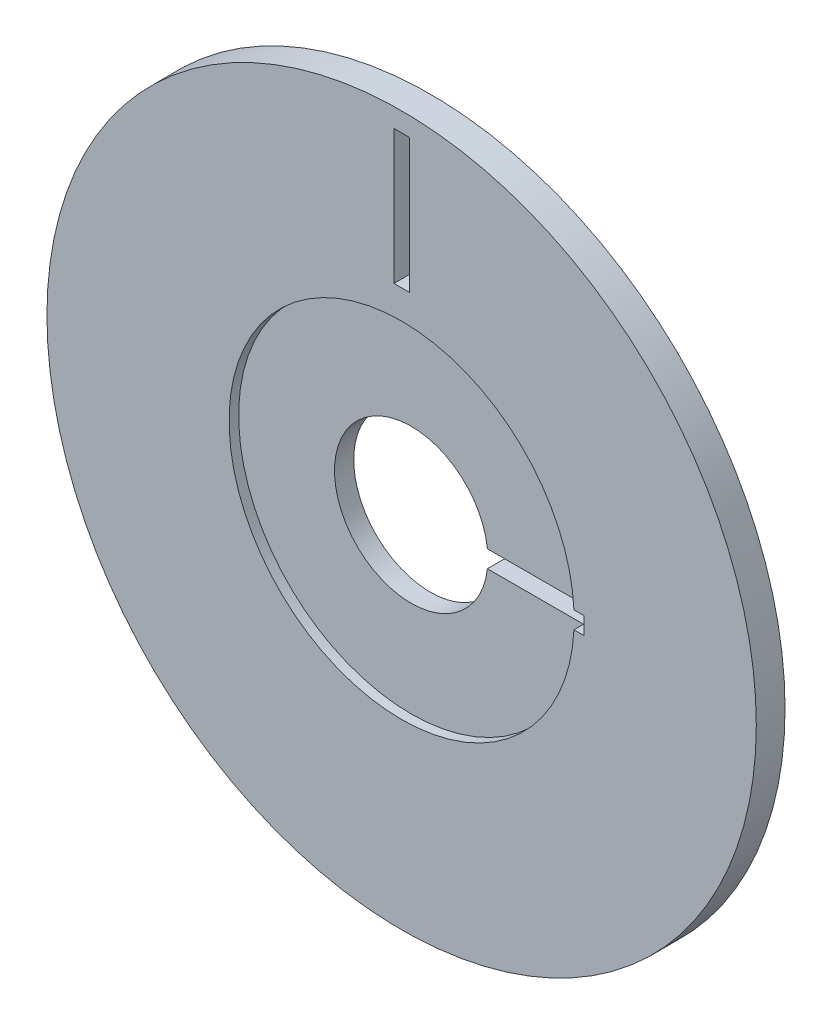
ISO-10303-21;
HEADER;
FILE_DESCRIPTION(('STEP AP214'),'2;1');
FILE_NAME('part.step','',(''),(''),'','','');
FILE_SCHEMA(('AUTOMOTIVE_DESIGN { 1 0 10303 214 1 1 1 1 }'));
ENDSEC;
DATA;
#1=APPLICATION_CONTEXT('core data for automotive mechanical design processes');
#2=APPLICATION_PROTOCOL_DEFINITION('international standard','automotive_design',2000,#1);
#3=PRODUCT_CONTEXT('',#1,'mechanical');
#4=PRODUCT('Part','Part','',(#3));
#5=PRODUCT_RELATED_PRODUCT_CATEGORY('part','',(#4));
#6=PRODUCT_DEFINITION_FORMATION('','',#4);
#7=PRODUCT_DEFINITION_CONTEXT('part definition',#1,'design');
#8=PRODUCT_DEFINITION('design','',#6,#7);
#9=PRODUCT_DEFINITION_SHAPE('','',#8);
#10=(LENGTH_UNIT() NAMED_UNIT(*) SI_UNIT(.MILLI.,.METRE.));
#11=(NAMED_UNIT(*) PLANE_ANGLE_UNIT() SI_UNIT($,.RADIAN.));
#12=(NAMED_UNIT(*) SI_UNIT($,.STERADIAN.) SOLID_ANGLE_UNIT());
#13=UNCERTAINTY_MEASURE_WITH_UNIT(LENGTH_MEASURE(1.E-05),#10,'distance_accuracy_value','');
#14=(GEOMETRIC_REPRESENTATION_CONTEXT(3) GLOBAL_UNCERTAINTY_ASSIGNED_CONTEXT((#13)) GLOBAL_UNIT_ASSIGNED_CONTEXT((#10,
#11,#12)) REPRESENTATION_CONTEXT('',''));
#15=CARTESIAN_POINT('',(0.,0.,0.));
#16=DIRECTION('',(0.,0.,1.));
#17=DIRECTION('',(1.,0.,0.));
#18=AXIS2_PLACEMENT_3D('',#15,#16,#17);
#19=CARTESIAN_POINT('',(0.,0.,0.));
#20=DIRECTION('',(0.,0.,1.));
#21=DIRECTION('',(1.,0.,0.));
#22=AXIS2_PLACEMENT_3D('',#19,#20,#21);
#23=CYLINDRICAL_SURFACE('',#22,4.);
#24=CARTESIAN_POINT('',(0.,0.,0.));
#25=DIRECTION('',(0.,0.,1.));
#26=DIRECTION('',(1.,0.,0.));
#27=AXIS2_PLACEMENT_3D('',#24,#25,#26);
#28=CIRCLE('',#27,4.);
#29=CARTESIAN_POINT('',(3.97460689880144,0.45,0.));
#30=VERTEX_POINT('',#29);
#31=CARTESIAN_POINT('',(3.97460689880144,-0.45,0.));
#32=VERTEX_POINT('',#31);
#33=EDGE_CURVE('E186',#30,#32,#28,.T.);
#34=ORIENTED_EDGE('',*,*,#33,.F.);
#35=DIRECTION('',(0.,0.,1.));
#36=VECTOR('',#35,1.);
#37=CARTESIAN_POINT('',(3.97460689880144,0.45,0.));
#38=LINE('',#37,#36);
#39=CARTESIAN_POINT('',(3.97460689880144,0.45,1.));
#40=VERTEX_POINT('',#39);
#41=EDGE_CURVE('E176',#30,#40,#38,.T.);
#42=ORIENTED_EDGE('',*,*,#41,.T.);
#43=CARTESIAN_POINT('',(0.,0.,1.));
#44=DIRECTION('',(0.,0.,1.));
#45=DIRECTION('',(1.,0.,0.));
#46=AXIS2_PLACEMENT_3D('',#43,#44,#45);
#47=CIRCLE('',#46,4.);
#48=CARTESIAN_POINT('',(3.97460689880144,-0.45,1.));
#49=VERTEX_POINT('',#48);
#50=EDGE_CURVE('E183',#49,#40,#47,.F.);
#51=ORIENTED_EDGE('',*,*,#50,.F.);
#52=DIRECTION('',(0.,0.,1.));
#53=VECTOR('',#52,1.);
#54=CARTESIAN_POINT('',(3.97460689880144,-0.45,0.));
#55=LINE('',#54,#53);
#56=EDGE_CURVE('E171',#49,#32,#55,.F.);
#57=ORIENTED_EDGE('',*,*,#56,.T.);
#58=EDGE_LOOP('',(#34,#42,#51,#57));
#59=FACE_BOUND('',#58,.T.);
#60=ADVANCED_FACE('F35',(#59),#23,.F.);
#61=CARTESIAN_POINT('',(0.,0.,1.5));
#62=DIRECTION('',(0.,0.,-1.));
#63=DIRECTION('',(-1.,0.,0.));
#64=AXIS2_PLACEMENT_3D('',#61,#62,#63);
#65=CYLINDRICAL_SURFACE('',#64,18.5);
#66=CARTESIAN_POINT('',(0.,0.,1.5));
#67=DIRECTION('',(0.,0.,1.));
#68=DIRECTION('',(1.,0.,0.));
#69=AXIS2_PLACEMENT_3D('',#66,#67,#68);
#70=CIRCLE('',#69,18.5);
#71=CARTESIAN_POINT('',(18.5,0.,1.5));
#72=VERTEX_POINT('',#71);
#73=EDGE_CURVE('E190',#72,#72,#70,.T.);
#74=ORIENTED_EDGE('',*,*,#73,.F.);
#75=EDGE_LOOP('',(#74));
#76=FACE_BOUND('',#75,.T.);
#77=CARTESIAN_POINT('',(0.,0.,0.));
#78=DIRECTION('',(0.,0.,1.));
#79=DIRECTION('',(1.,0.,0.));
#80=AXIS2_PLACEMENT_3D('',#77,#78,#79);
#81=CIRCLE('',#80,18.5);
#82=CARTESIAN_POINT('',(18.5,0.,0.));
#83=VERTEX_POINT('',#82);
#84=EDGE_CURVE('E189',#83,#83,#81,.T.);
#85=ORIENTED_EDGE('',*,*,#84,.T.);
#86=EDGE_LOOP('',(#85));
#87=FACE_BOUND('',#86,.T.);
#88=ADVANCED_FACE('F37',(#76,#87),#65,.T.);
#89=CARTESIAN_POINT('',(0.,0.,1.5));
#90=DIRECTION('',(0.,0.,1.));
#91=DIRECTION('',(1.,0.,0.));
#92=AXIS2_PLACEMENT_3D('',#89,#90,#91);
#93=PLANE('',#92);
#94=DIRECTION('',(0.,-1.,0.));
#95=VECTOR('',#94,1.);
#96=CARTESIAN_POINT('',(-0.399999999999996,17.5,1.5));
#97=LINE('',#96,#95);
#98=CARTESIAN_POINT('',(-0.399999999999996,17.5,1.5));
#99=VERTEX_POINT('',#98);
#100=CARTESIAN_POINT('',(-0.399999999999996,10.5,1.5));
#101=VERTEX_POINT('',#100);
#102=EDGE_CURVE('E50',#99,#101,#97,.T.);
#103=ORIENTED_EDGE('',*,*,#102,.F.);
#104=DIRECTION('',(-1.,0.,0.));
#105=VECTOR('',#104,1.);
#106=CARTESIAN_POINT('',(-0.399999999999996,17.5,1.5));
#107=LINE('',#106,#105);
#108=CARTESIAN_POINT('',(0.400000000000001,17.5,1.5));
#109=VERTEX_POINT('',#108);
#110=EDGE_CURVE('E130',#109,#99,#107,.T.);
#111=ORIENTED_EDGE('',*,*,#110,.F.);
#112=DIRECTION('',(0.,1.,0.));
#113=VECTOR('',#112,1.);
#114=CARTESIAN_POINT('',(0.400000000000001,17.5,1.5));
#115=LINE('',#114,#113);
#116=CARTESIAN_POINT('',(0.400000000000004,10.5,1.5));
#117=VERTEX_POINT('',#116);
#118=EDGE_CURVE('E133',#117,#109,#115,.T.);
#119=ORIENTED_EDGE('',*,*,#118,.F.);
#120=DIRECTION('',(1.,0.,0.));
#121=VECTOR('',#120,1.);
#122=CARTESIAN_POINT('',(-0.399999999999996,10.5,1.5));
#123=LINE('',#122,#121);
#124=EDGE_CURVE('E139',#101,#117,#123,.T.);
#125=ORIENTED_EDGE('',*,*,#124,.F.);
#126=EDGE_LOOP('',(#103,#111,#119,#125));
#127=FACE_BOUND('',#126,.T.);
#128=DIRECTION('',(-1.,0.,0.));
#129=VECTOR('',#128,1.);
#130=CARTESIAN_POINT('',(2.51344942734549,0.45,1.5));
#131=LINE('',#130,#129);
#132=CARTESIAN_POINT('',(9.51344942734548,0.45,1.5));
#133=VERTEX_POINT('',#132);
#134=CARTESIAN_POINT('',(8.98874295994718,0.45,1.5));
#135=VERTEX_POINT('',#134);
#136=EDGE_CURVE('E153',#133,#135,#131,.T.);
#137=ORIENTED_EDGE('',*,*,#136,.F.);
#138=DIRECTION('',(0.,1.,0.));
#139=VECTOR('',#138,1.);
#140=CARTESIAN_POINT('',(9.51344942734548,0.45,1.5));
#141=LINE('',#140,#139);
#142=CARTESIAN_POINT('',(9.51344942734548,-0.45,1.5));
#143=VERTEX_POINT('',#142);
#144=EDGE_CURVE('E161',#143,#133,#141,.T.);
#145=ORIENTED_EDGE('',*,*,#144,.F.);
#146=DIRECTION('',(1.,0.,0.));
#147=VECTOR('',#146,1.);
#148=CARTESIAN_POINT('',(2.51344942734549,-0.45,1.5));
#149=LINE('',#148,#147);
#150=CARTESIAN_POINT('',(8.98874295994718,-0.45,1.5));
#151=VERTEX_POINT('',#150);
#152=EDGE_CURVE('E145',#151,#143,#149,.T.);
#153=ORIENTED_EDGE('',*,*,#152,.F.);
#154=CARTESIAN_POINT('',(0.,0.,1.5));
#155=DIRECTION('',(0.,0.,1.));
#156=DIRECTION('',(1.,0.,0.));
#157=AXIS2_PLACEMENT_3D('',#154,#155,#156);
#158=CIRCLE('',#157,9.);
#159=EDGE_CURVE('E179',#135,#151,#158,.T.);
#160=ORIENTED_EDGE('',*,*,#159,.F.);
#161=EDGE_LOOP('',(#137,#145,#153,#160));
#162=FACE_BOUND('',#161,.T.);
#163=ORIENTED_EDGE('',*,*,#73,.T.);
#164=EDGE_LOOP('',(#163));
#165=FACE_BOUND('',#164,.T.);
#166=ADVANCED_FACE('F220',(#127,#162,#165),#93,.T.);
#167=CARTESIAN_POINT('',(0.,0.,0.));
#168=DIRECTION('',(0.,0.,1.));
#169=DIRECTION('',(1.,0.,0.));
#170=AXIS2_PLACEMENT_3D('',#167,#168,#169);
#171=PLANE('',#170);
#172=DIRECTION('',(-1.,0.,0.));
#173=VECTOR('',#172,1.);
#174=CARTESIAN_POINT('',(-0.399999999999996,17.5,0.));
#175=LINE('',#174,#173);
#176=CARTESIAN_POINT('',(0.400000000000001,17.5,0.));
#177=VERTEX_POINT('',#176);
#178=CARTESIAN_POINT('',(-0.399999999999996,17.5,0.));
#179=VERTEX_POINT('',#178);
#180=EDGE_CURVE('E120',#177,#179,#175,.T.);
#181=ORIENTED_EDGE('',*,*,#180,.T.);
#182=DIRECTION('',(0.,-1.,0.));
#183=VECTOR('',#182,1.);
#184=CARTESIAN_POINT('',(-0.399999999999996,17.5,0.));
#185=LINE('',#184,#183);
#186=CARTESIAN_POINT('',(-0.399999999999996,10.5,0.));
#187=VERTEX_POINT('',#186);
#188=EDGE_CURVE('E114',#179,#187,#185,.T.);
#189=ORIENTED_EDGE('',*,*,#188,.T.);
#190=DIRECTION('',(1.,0.,0.));
#191=VECTOR('',#190,1.);
#192=CARTESIAN_POINT('',(-0.399999999999996,10.5,0.));
#193=LINE('',#192,#191);
#194=CARTESIAN_POINT('',(0.400000000000004,10.5,0.));
#195=VERTEX_POINT('',#194);
#196=EDGE_CURVE('E123',#187,#195,#193,.T.);
#197=ORIENTED_EDGE('',*,*,#196,.T.);
#198=DIRECTION('',(0.,1.,0.));
#199=VECTOR('',#198,1.);
#200=CARTESIAN_POINT('',(0.400000000000001,17.5,0.));
#201=LINE('',#200,#199);
#202=EDGE_CURVE('E58',#195,#177,#201,.T.);
#203=ORIENTED_EDGE('',*,*,#202,.T.);
#204=EDGE_LOOP('',(#181,#189,#197,#203));
#205=FACE_BOUND('',#204,.T.);
#206=DIRECTION('',(0.,1.,0.));
#207=VECTOR('',#206,1.);
#208=CARTESIAN_POINT('',(9.51344942734548,0.45,0.));
#209=LINE('',#208,#207);
#210=CARTESIAN_POINT('',(9.51344942734548,-0.45,0.));
#211=VERTEX_POINT('',#210);
#212=CARTESIAN_POINT('',(9.51344942734548,0.45,0.));
#213=VERTEX_POINT('',#212);
#214=EDGE_CURVE('E152',#211,#213,#209,.T.);
#215=ORIENTED_EDGE('',*,*,#214,.T.);
#216=DIRECTION('',(-1.,0.,0.));
#217=VECTOR('',#216,1.);
#218=CARTESIAN_POINT('',(2.51344942734549,0.45,0.));
#219=LINE('',#218,#217);
#220=EDGE_CURVE('E156',#213,#30,#219,.T.);
#221=ORIENTED_EDGE('',*,*,#220,.T.);
#222=ORIENTED_EDGE('',*,*,#33,.T.);
#223=DIRECTION('',(1.,0.,0.));
#224=VECTOR('',#223,1.);
#225=CARTESIAN_POINT('',(2.51344942734549,-0.45,0.));
#226=LINE('',#225,#224);
#227=EDGE_CURVE('E149',#32,#211,#226,.T.);
#228=ORIENTED_EDGE('',*,*,#227,.T.);
#229=EDGE_LOOP('',(#215,#221,#222,#228));
#230=FACE_BOUND('',#229,.T.);
#231=ORIENTED_EDGE('',*,*,#84,.F.);
#232=EDGE_LOOP('',(#231));
#233=FACE_BOUND('',#232,.T.);
#234=ADVANCED_FACE('F127',(#205,#230,#233),#171,.F.);
#235=CARTESIAN_POINT('',(0.,0.,1.));
#236=DIRECTION('',(0.,0.,1.));
#237=DIRECTION('',(1.,0.,0.));
#238=AXIS2_PLACEMENT_3D('',#235,#236,#237);
#239=PLANE('',#238);
#240=DIRECTION('',(-1.,0.,0.));
#241=VECTOR('',#240,1.);
#242=CARTESIAN_POINT('',(0.,0.45,1.));
#243=LINE('',#242,#241);
#244=CARTESIAN_POINT('',(8.98874295994718,0.45,1.));
#245=VERTEX_POINT('',#244);
#246=EDGE_CURVE('E174',#245,#40,#243,.T.);
#247=ORIENTED_EDGE('',*,*,#246,.F.);
#248=CARTESIAN_POINT('',(0.,0.,1.));
#249=DIRECTION('',(0.,0.,1.));
#250=DIRECTION('',(1.,0.,0.));
#251=AXIS2_PLACEMENT_3D('',#248,#249,#250);
#252=CIRCLE('',#251,9.);
#253=CARTESIAN_POINT('',(8.98874295994718,-0.45,1.));
#254=VERTEX_POINT('',#253);
#255=EDGE_CURVE('E180',#245,#254,#252,.T.);
#256=ORIENTED_EDGE('',*,*,#255,.T.);
#257=DIRECTION('',(1.,0.,0.));
#258=VECTOR('',#257,1.);
#259=CARTESIAN_POINT('',(0.,-0.45,1.));
#260=LINE('',#259,#258);
#261=EDGE_CURVE('E167',#49,#254,#260,.T.);
#262=ORIENTED_EDGE('',*,*,#261,.F.);
#263=ORIENTED_EDGE('',*,*,#50,.T.);
#264=EDGE_LOOP('',(#247,#256,#262,#263));
#265=FACE_BOUND('',#264,.T.);
#266=ADVANCED_FACE('F206',(#265),#239,.T.);
#267=CARTESIAN_POINT('',(0.,0.,1.));
#268=DIRECTION('',(0.,0.,1.));
#269=DIRECTION('',(1.,0.,0.));
#270=AXIS2_PLACEMENT_3D('',#267,#268,#269);
#271=CYLINDRICAL_SURFACE('',#270,9.);
#272=ORIENTED_EDGE('',*,*,#255,.F.);
#273=DIRECTION('',(0.,0.,1.));
#274=VECTOR('',#273,1.);
#275=CARTESIAN_POINT('',(8.98874295994718,0.45,1.));
#276=LINE('',#275,#274);
#277=EDGE_CURVE('E11',#245,#135,#276,.T.);
#278=ORIENTED_EDGE('',*,*,#277,.T.);
#279=ORIENTED_EDGE('',*,*,#159,.T.);
#280=DIRECTION('',(0.,0.,1.));
#281=VECTOR('',#280,1.);
#282=CARTESIAN_POINT('',(8.98874295994718,-0.45,1.));
#283=LINE('',#282,#281);
#284=EDGE_CURVE('E43',#151,#254,#283,.F.);
#285=ORIENTED_EDGE('',*,*,#284,.T.);
#286=EDGE_LOOP('',(#272,#278,#279,#285));
#287=FACE_BOUND('',#286,.T.);
#288=ADVANCED_FACE('F199',(#287),#271,.F.);
#289=CARTESIAN_POINT('',(2.51344942734549,0.45,0.));
#290=DIRECTION('',(0.,1.,0.));
#291=DIRECTION('',(0.,0.,1.));
#292=AXIS2_PLACEMENT_3D('',#289,#290,#291);
#293=PLANE('',#292);
#294=ORIENTED_EDGE('',*,*,#220,.F.);
#295=DIRECTION('',(0.,0.,1.));
#296=VECTOR('',#295,1.);
#297=CARTESIAN_POINT('',(9.51344942734548,0.45,0.));
#298=LINE('',#297,#296);
#299=EDGE_CURVE('E165',#213,#133,#298,.T.);
#300=ORIENTED_EDGE('',*,*,#299,.T.);
#301=ORIENTED_EDGE('',*,*,#136,.T.);
#302=ORIENTED_EDGE('',*,*,#277,.F.);
#303=ORIENTED_EDGE('',*,*,#246,.T.);
#304=ORIENTED_EDGE('',*,*,#41,.F.);
#305=EDGE_LOOP('',(#294,#300,#301,#302,#303,#304));
#306=FACE_BOUND('',#305,.T.);
#307=ADVANCED_FACE('F210',(#306),#293,.F.);
#308=CARTESIAN_POINT('',(2.51344942734549,-0.45,0.));
#309=DIRECTION('',(0.,-1.,0.));
#310=DIRECTION('',(0.,0.,-1.));
#311=AXIS2_PLACEMENT_3D('',#308,#309,#310);
#312=PLANE('',#311);
#313=ORIENTED_EDGE('',*,*,#261,.T.);
#314=ORIENTED_EDGE('',*,*,#284,.F.);
#315=ORIENTED_EDGE('',*,*,#152,.T.);
#316=DIRECTION('',(0.,0.,1.));
#317=VECTOR('',#316,1.);
#318=CARTESIAN_POINT('',(9.51344942734548,-0.45,0.));
#319=LINE('',#318,#317);
#320=EDGE_CURVE('E159',#211,#143,#319,.T.);
#321=ORIENTED_EDGE('',*,*,#320,.F.);
#322=ORIENTED_EDGE('',*,*,#227,.F.);
#323=ORIENTED_EDGE('',*,*,#56,.F.);
#324=EDGE_LOOP('',(#313,#314,#315,#321,#322,#323));
#325=FACE_BOUND('',#324,.T.);
#326=ADVANCED_FACE('F222',(#325),#312,.F.);
#327=CARTESIAN_POINT('',(9.51344942734548,0.45,0.));
#328=DIRECTION('',(1.,0.,0.));
#329=DIRECTION('',(0.,0.,-1.));
#330=AXIS2_PLACEMENT_3D('',#327,#328,#329);
#331=PLANE('',#330);
#332=ORIENTED_EDGE('',*,*,#144,.T.);
#333=ORIENTED_EDGE('',*,*,#299,.F.);
#334=ORIENTED_EDGE('',*,*,#214,.F.);
#335=ORIENTED_EDGE('',*,*,#320,.T.);
#336=EDGE_LOOP('',(#332,#333,#334,#335));
#337=FACE_BOUND('',#336,.T.);
#338=ADVANCED_FACE('F218',(#337),#331,.F.);
#339=CARTESIAN_POINT('',(-0.399999999999996,17.5,0.));
#340=DIRECTION('',(-1.,0.,0.));
#341=DIRECTION('',(0.,-1.,0.));
#342=AXIS2_PLACEMENT_3D('',#339,#340,#341);
#343=PLANE('',#342);
#344=ORIENTED_EDGE('',*,*,#102,.T.);
#345=DIRECTION('',(0.,0.,1.));
#346=VECTOR('',#345,1.);
#347=CARTESIAN_POINT('',(-0.399999999999996,10.5,0.));
#348=LINE('',#347,#346);
#349=EDGE_CURVE('E110',#187,#101,#348,.T.);
#350=ORIENTED_EDGE('',*,*,#349,.F.);
#351=ORIENTED_EDGE('',*,*,#188,.F.);
#352=DIRECTION('',(0.,0.,1.));
#353=VECTOR('',#352,1.);
#354=CARTESIAN_POINT('',(-0.399999999999996,17.5,0.));
#355=LINE('',#354,#353);
#356=EDGE_CURVE('E143',#179,#99,#355,.T.);
#357=ORIENTED_EDGE('',*,*,#356,.T.);
#358=EDGE_LOOP('',(#344,#350,#351,#357));
#359=FACE_BOUND('',#358,.T.);
#360=ADVANCED_FACE('F112',(#359),#343,.F.);
#361=CARTESIAN_POINT('',(-0.399999999999996,17.5,0.));
#362=DIRECTION('',(0.,1.,0.));
#363=DIRECTION('',(0.,0.,1.));
#364=AXIS2_PLACEMENT_3D('',#361,#362,#363);
#365=PLANE('',#364);
#366=ORIENTED_EDGE('',*,*,#110,.T.);
#367=ORIENTED_EDGE('',*,*,#356,.F.);
#368=ORIENTED_EDGE('',*,*,#180,.F.);
#369=DIRECTION('',(0.,0.,1.));
#370=VECTOR('',#369,1.);
#371=CARTESIAN_POINT('',(0.400000000000001,17.5,0.));
#372=LINE('',#371,#370);
#373=EDGE_CURVE('E146',#177,#109,#372,.T.);
#374=ORIENTED_EDGE('',*,*,#373,.T.);
#375=EDGE_LOOP('',(#366,#367,#368,#374));
#376=FACE_BOUND('',#375,.T.);
#377=ADVANCED_FACE('F300',(#376),#365,.F.);
#378=CARTESIAN_POINT('',(0.400000000000001,17.5,0.));
#379=DIRECTION('',(1.,0.,0.));
#380=DIRECTION('',(0.,1.,0.));
#381=AXIS2_PLACEMENT_3D('',#378,#379,#380);
#382=PLANE('',#381);
#383=ORIENTED_EDGE('',*,*,#118,.T.);
#384=ORIENTED_EDGE('',*,*,#373,.F.);
#385=ORIENTED_EDGE('',*,*,#202,.F.);
#386=DIRECTION('',(0.,0.,1.));
#387=VECTOR('',#386,1.);
#388=CARTESIAN_POINT('',(0.400000000000004,10.5,0.));
#389=LINE('',#388,#387);
#390=EDGE_CURVE('E119',#195,#117,#389,.T.);
#391=ORIENTED_EDGE('',*,*,#390,.T.);
#392=EDGE_LOOP('',(#383,#384,#385,#391));
#393=FACE_BOUND('',#392,.T.);
#394=ADVANCED_FACE('F306',(#393),#382,.F.);
#395=CARTESIAN_POINT('',(-0.399999999999996,10.5,0.));
#396=DIRECTION('',(0.,-1.,0.));
#397=DIRECTION('',(0.,0.,-1.));
#398=AXIS2_PLACEMENT_3D('',#395,#396,#397);
#399=PLANE('',#398);
#400=ORIENTED_EDGE('',*,*,#124,.T.);
#401=ORIENTED_EDGE('',*,*,#390,.F.);
#402=ORIENTED_EDGE('',*,*,#196,.F.);
#403=ORIENTED_EDGE('',*,*,#349,.T.);
#404=EDGE_LOOP('',(#400,#401,#402,#403));
#405=FACE_BOUND('',#404,.T.);
#406=ADVANCED_FACE('F124',(#405),#399,.F.);
#407=CLOSED_SHELL('',(#60,#88,#166,#234,#266,#288,#307,#326,#338,#360,#377,#394,#406));
#408=MANIFOLD_SOLID_BREP('B2',#407);
#409=ADVANCED_BREP_SHAPE_REPRESENTATION('',(#18,#408),#14);
#410=SHAPE_DEFINITION_REPRESENTATION(#9,#409);
ENDSEC;
END-ISO-10303-21;
